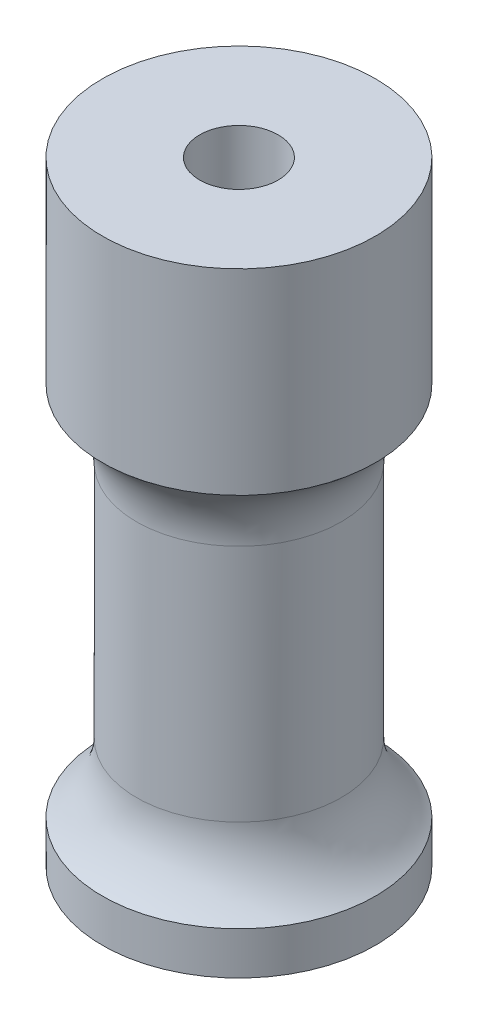
ISO-10303-21;
HEADER;
FILE_DESCRIPTION(('STEP AP214'),'2;1');
FILE_NAME('part.step','',(''),(''),'','','');
FILE_SCHEMA(('AUTOMOTIVE_DESIGN { 1 0 10303 214 1 1 1 1 }'));
ENDSEC;
DATA;
#1=APPLICATION_CONTEXT('core data for automotive mechanical design processes');
#2=APPLICATION_PROTOCOL_DEFINITION('international standard','automotive_design',2000,#1);
#3=PRODUCT_CONTEXT('',#1,'mechanical');
#4=PRODUCT('Part','Part','',(#3));
#5=PRODUCT_RELATED_PRODUCT_CATEGORY('part','',(#4));
#6=PRODUCT_DEFINITION_FORMATION('','',#4);
#7=PRODUCT_DEFINITION_CONTEXT('part definition',#1,'design');
#8=PRODUCT_DEFINITION('design','',#6,#7);
#9=PRODUCT_DEFINITION_SHAPE('','',#8);
#10=(LENGTH_UNIT() NAMED_UNIT(*) SI_UNIT(.MILLI.,.METRE.));
#11=(NAMED_UNIT(*) PLANE_ANGLE_UNIT() SI_UNIT($,.RADIAN.));
#12=(NAMED_UNIT(*) SI_UNIT($,.STERADIAN.) SOLID_ANGLE_UNIT());
#13=UNCERTAINTY_MEASURE_WITH_UNIT(LENGTH_MEASURE(1.E-05),#10,'distance_accuracy_value','');
#14=(GEOMETRIC_REPRESENTATION_CONTEXT(3) GLOBAL_UNCERTAINTY_ASSIGNED_CONTEXT((#13)) GLOBAL_UNIT_ASSIGNED_CONTEXT((#10,
#11,#12)) REPRESENTATION_CONTEXT('',''));
#15=CARTESIAN_POINT('',(0.,0.,0.));
#16=DIRECTION('',(0.,0.,1.));
#17=DIRECTION('',(1.,0.,0.));
#18=AXIS2_PLACEMENT_3D('',#15,#16,#17);
#19=CARTESIAN_POINT('',(0.,0.,0.));
#20=DIRECTION('',(0.,-1.,0.));
#21=DIRECTION('',(0.,0.,-1.));
#22=AXIS2_PLACEMENT_3D('',#19,#20,#21);
#23=CYLINDRICAL_SURFACE('',#22,2.3);
#24=CARTESIAN_POINT('',(0.,0.,0.));
#25=DIRECTION('',(0.,-1.,0.));
#26=DIRECTION('',(0.,0.,-1.));
#27=AXIS2_PLACEMENT_3D('',#24,#25,#26);
#28=CIRCLE('',#27,2.3);
#29=CARTESIAN_POINT('',(0.,0.,-2.3));
#30=VERTEX_POINT('',#29);
#31=EDGE_CURVE('E41',#30,#30,#28,.T.);
#32=ORIENTED_EDGE('',*,*,#31,.T.);
#33=EDGE_LOOP('',(#32));
#34=FACE_BOUND('',#33,.T.);
#35=CARTESIAN_POINT('',(0.,36.,0.));
#36=DIRECTION('',(0.,-1.,0.));
#37=DIRECTION('',(0.,0.,-1.));
#38=AXIS2_PLACEMENT_3D('',#35,#36,#37);
#39=CIRCLE('',#38,2.3);
#40=CARTESIAN_POINT('',(0.,36.,-2.3));
#41=VERTEX_POINT('',#40);
#42=EDGE_CURVE('E45',#41,#41,#39,.T.);
#43=ORIENTED_EDGE('',*,*,#42,.F.);
#44=EDGE_LOOP('',(#43));
#45=FACE_BOUND('',#44,.T.);
#46=ADVANCED_FACE('F30',(#34,#45),#23,.F.);
#47=CARTESIAN_POINT('',(8.,36.,0.));
#48=DIRECTION('',(0.,1.,0.));
#49=DIRECTION('',(0.,0.,1.));
#50=AXIS2_PLACEMENT_3D('',#47,#48,#49);
#51=PLANE('',#50);
#52=ORIENTED_EDGE('',*,*,#42,.T.);
#53=EDGE_LOOP('',(#52));
#54=FACE_BOUND('',#53,.T.);
#55=CARTESIAN_POINT('',(0.,36.,0.));
#56=DIRECTION('',(0.,-1.,0.));
#57=DIRECTION('',(0.,0.,-1.));
#58=AXIS2_PLACEMENT_3D('',#55,#56,#57);
#59=CIRCLE('',#58,8.);
#60=CARTESIAN_POINT('',(0.,36.,-8.));
#61=VERTEX_POINT('',#60);
#62=EDGE_CURVE('E50',#61,#61,#59,.T.);
#63=ORIENTED_EDGE('',*,*,#62,.F.);
#64=EDGE_LOOP('',(#63));
#65=FACE_BOUND('',#64,.T.);
#66=ADVANCED_FACE('F80',(#54,#65),#51,.T.);
#67=CARTESIAN_POINT('',(0.,0.,0.));
#68=DIRECTION('',(0.,-1.,0.));
#69=DIRECTION('',(0.,0.,-1.));
#70=AXIS2_PLACEMENT_3D('',#67,#68,#69);
#71=CYLINDRICAL_SURFACE('',#70,8.);
#72=ORIENTED_EDGE('',*,*,#62,.T.);
#73=EDGE_LOOP('',(#72));
#74=FACE_BOUND('',#73,.T.);
#75=CARTESIAN_POINT('',(0.,24.5,0.));
#76=DIRECTION('',(0.,-1.,0.));
#77=DIRECTION('',(0.,0.,-1.));
#78=AXIS2_PLACEMENT_3D('',#75,#76,#77);
#79=CIRCLE('',#78,8.);
#80=CARTESIAN_POINT('',(0.,24.5,-8.));
#81=VERTEX_POINT('',#80);
#82=EDGE_CURVE('E53',#81,#81,#79,.T.);
#83=ORIENTED_EDGE('',*,*,#82,.F.);
#84=EDGE_LOOP('',(#83));
#85=FACE_BOUND('',#84,.T.);
#86=ADVANCED_FACE('F77',(#74,#85),#71,.T.);
#87=CARTESIAN_POINT('',(0.,0.,0.));
#88=DIRECTION('',(0.,-1.,0.));
#89=DIRECTION('',(0.,0.,-1.));
#90=AXIS2_PLACEMENT_3D('',#87,#88,#89);
#91=CYLINDRICAL_SURFACE('',#90,6.);
#92=CARTESIAN_POINT('',(0.,20.5,0.));
#93=DIRECTION('',(0.,1.,0.));
#94=DIRECTION('',(0.,0.,1.));
#95=AXIS2_PLACEMENT_3D('',#92,#93,#94);
#96=CIRCLE('',#95,6.);
#97=CARTESIAN_POINT('',(0.,20.5,6.));
#98=VERTEX_POINT('',#97);
#99=EDGE_CURVE('E10',#98,#98,#96,.F.);
#100=ORIENTED_EDGE('',*,*,#99,.T.);
#101=EDGE_LOOP('',(#100));
#102=FACE_BOUND('',#101,.T.);
#103=CARTESIAN_POINT('',(0.,6.5,0.));
#104=DIRECTION('',(0.,-1.,0.));
#105=DIRECTION('',(0.,0.,-1.));
#106=AXIS2_PLACEMENT_3D('',#103,#104,#105);
#107=CIRCLE('',#106,6.);
#108=CARTESIAN_POINT('',(0.,6.5,-6.));
#109=VERTEX_POINT('',#108);
#110=EDGE_CURVE('E37',#109,#109,#107,.F.);
#111=ORIENTED_EDGE('',*,*,#110,.T.);
#112=EDGE_LOOP('',(#111));
#113=FACE_BOUND('',#112,.T.);
#114=ADVANCED_FACE('F68',(#102,#113),#91,.T.);
#115=CARTESIAN_POINT('',(0.,0.,0.));
#116=DIRECTION('',(0.,-1.,0.));
#117=DIRECTION('',(0.,0.,-1.));
#118=AXIS2_PLACEMENT_3D('',#115,#116,#117);
#119=CYLINDRICAL_SURFACE('',#118,8.);
#120=CARTESIAN_POINT('',(0.,2.5,0.));
#121=DIRECTION('',(0.,-1.,0.));
#122=DIRECTION('',(0.,0.,-1.));
#123=AXIS2_PLACEMENT_3D('',#120,#121,#122);
#124=CIRCLE('',#123,8.);
#125=CARTESIAN_POINT('',(0.,2.5,-8.));
#126=VERTEX_POINT('',#125);
#127=EDGE_CURVE('E56',#126,#126,#124,.T.);
#128=ORIENTED_EDGE('',*,*,#127,.T.);
#129=EDGE_LOOP('',(#128));
#130=FACE_BOUND('',#129,.T.);
#131=CARTESIAN_POINT('',(0.,0.,0.));
#132=DIRECTION('',(0.,-1.,0.));
#133=DIRECTION('',(0.,0.,-1.));
#134=AXIS2_PLACEMENT_3D('',#131,#132,#133);
#135=CIRCLE('',#134,8.);
#136=CARTESIAN_POINT('',(0.,0.,-8.));
#137=VERTEX_POINT('',#136);
#138=EDGE_CURVE('E59',#137,#137,#135,.T.);
#139=ORIENTED_EDGE('',*,*,#138,.F.);
#140=EDGE_LOOP('',(#139));
#141=FACE_BOUND('',#140,.T.);
#142=ADVANCED_FACE('F66',(#130,#141),#119,.T.);
#143=CARTESIAN_POINT('',(6.,0.,0.));
#144=DIRECTION('',(0.,-1.,0.));
#145=DIRECTION('',(0.,0.,-1.));
#146=AXIS2_PLACEMENT_3D('',#143,#144,#145);
#147=PLANE('',#146);
#148=ORIENTED_EDGE('',*,*,#138,.T.);
#149=EDGE_LOOP('',(#148));
#150=FACE_BOUND('',#149,.T.);
#151=ORIENTED_EDGE('',*,*,#31,.F.);
#152=EDGE_LOOP('',(#151));
#153=FACE_BOUND('',#152,.T.);
#154=ADVANCED_FACE('F63',(#150,#153),#147,.T.);
#155=CARTESIAN_POINT('',(0.,20.5,0.));
#156=DIRECTION('',(0.,1.,0.));
#157=DIRECTION('',(0.,0.,1.));
#158=AXIS2_PLACEMENT_3D('',#155,#156,#157);
#159=TOROIDAL_SURFACE('',#158,11.,5.);
#160=ORIENTED_EDGE('',*,*,#82,.T.);
#161=EDGE_LOOP('',(#160));
#162=FACE_BOUND('',#161,.T.);
#163=ORIENTED_EDGE('',*,*,#99,.F.);
#164=EDGE_LOOP('',(#163));
#165=FACE_BOUND('',#164,.T.);
#166=ADVANCED_FACE('F75',(#162,#165),#159,.F.);
#167=CARTESIAN_POINT('',(0.,6.5,0.));
#168=DIRECTION('',(0.,-1.,0.));
#169=DIRECTION('',(0.,0.,-1.));
#170=AXIS2_PLACEMENT_3D('',#167,#168,#169);
#171=TOROIDAL_SURFACE('',#170,11.,5.);
#172=ORIENTED_EDGE('',*,*,#110,.F.);
#173=EDGE_LOOP('',(#172));
#174=FACE_BOUND('',#173,.T.);
#175=ORIENTED_EDGE('',*,*,#127,.F.);
#176=EDGE_LOOP('',(#175));
#177=FACE_BOUND('',#176,.T.);
#178=ADVANCED_FACE('F32',(#174,#177),#171,.F.);
#179=CLOSED_SHELL('',(#46,#66,#86,#114,#142,#154,#166,#178));
#180=MANIFOLD_SOLID_BREP('B2',#179);
#181=ADVANCED_BREP_SHAPE_REPRESENTATION('',(#18,#180),#14);
#182=SHAPE_DEFINITION_REPRESENTATION(#9,#181);
ENDSEC;
END-ISO-10303-21;
